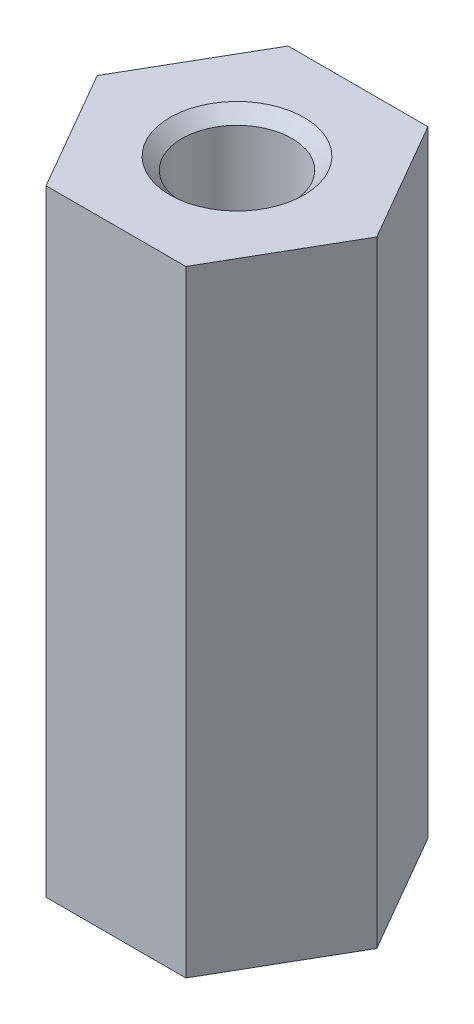
ISO-10303-21;
HEADER;
FILE_DESCRIPTION(('STEP AP214'),'2;1');
FILE_NAME('part.step','',(''),(''),'','','');
FILE_SCHEMA(('AUTOMOTIVE_DESIGN { 1 0 10303 214 1 1 1 1 }'));
ENDSEC;
DATA;
#1=APPLICATION_CONTEXT('core data for automotive mechanical design processes');
#2=APPLICATION_PROTOCOL_DEFINITION('international standard','automotive_design',2000,#1);
#3=PRODUCT_CONTEXT('',#1,'mechanical');
#4=PRODUCT('Part','Part','',(#3));
#5=PRODUCT_RELATED_PRODUCT_CATEGORY('part','',(#4));
#6=PRODUCT_DEFINITION_FORMATION('','',#4);
#7=PRODUCT_DEFINITION_CONTEXT('part definition',#1,'design');
#8=PRODUCT_DEFINITION('design','',#6,#7);
#9=PRODUCT_DEFINITION_SHAPE('','',#8);
#10=(LENGTH_UNIT() NAMED_UNIT(*) SI_UNIT(.MILLI.,.METRE.));
#11=(NAMED_UNIT(*) PLANE_ANGLE_UNIT() SI_UNIT($,.RADIAN.));
#12=(NAMED_UNIT(*) SI_UNIT($,.STERADIAN.) SOLID_ANGLE_UNIT());
#13=UNCERTAINTY_MEASURE_WITH_UNIT(LENGTH_MEASURE(1.E-05),#10,'distance_accuracy_value','');
#14=(GEOMETRIC_REPRESENTATION_CONTEXT(3) GLOBAL_UNCERTAINTY_ASSIGNED_CONTEXT((#13)) GLOBAL_UNIT_ASSIGNED_CONTEXT((#10,
#11,#12)) REPRESENTATION_CONTEXT('',''));
#15=CARTESIAN_POINT('',(0.,0.,0.));
#16=DIRECTION('',(0.,0.,1.));
#17=DIRECTION('',(1.,0.,0.));
#18=AXIS2_PLACEMENT_3D('',#15,#16,#17);
#19=CARTESIAN_POINT('',(1.5877132402715,14.,2.74999999999998));
#20=DIRECTION('',(-0.866025403784441,0.,-0.499999999999995));
#21=DIRECTION('',(-0.499999999999995,0.,0.866025403784442));
#22=AXIS2_PLACEMENT_3D('',#19,#20,#21);
#23=PLANE('',#22);
#24=DIRECTION('',(0.499999999999995,0.,-0.866025403784442));
#25=VECTOR('',#24,1.);
#26=CARTESIAN_POINT('',(1.5877132402715,0.,2.74999999999998));
#27=LINE('',#26,#25);
#28=CARTESIAN_POINT('',(1.5877132402715,0.,2.74999999999998));
#29=VERTEX_POINT('',#28);
#30=CARTESIAN_POINT('',(3.17542648054294,0.,0.));
#31=VERTEX_POINT('',#30);
#32=EDGE_CURVE('E121',#29,#31,#27,.T.);
#33=ORIENTED_EDGE('',*,*,#32,.T.);
#34=DIRECTION('',(0.,-1.,0.));
#35=VECTOR('',#34,1.);
#36=CARTESIAN_POINT('',(3.17542648054294,14.,0.));
#37=LINE('',#36,#35);
#38=CARTESIAN_POINT('',(3.17542648054294,14.,0.));
#39=VERTEX_POINT('',#38);
#40=EDGE_CURVE('E11',#39,#31,#37,.T.);
#41=ORIENTED_EDGE('',*,*,#40,.F.);
#42=DIRECTION('',(0.499999999999995,0.,-0.866025403784442));
#43=VECTOR('',#42,1.);
#44=CARTESIAN_POINT('',(1.5877132402715,14.,2.74999999999998));
#45=LINE('',#44,#43);
#46=CARTESIAN_POINT('',(1.5877132402715,14.,2.74999999999998));
#47=VERTEX_POINT('',#46);
#48=EDGE_CURVE('E132',#47,#39,#45,.T.);
#49=ORIENTED_EDGE('',*,*,#48,.F.);
#50=DIRECTION('',(0.,-1.,0.));
#51=VECTOR('',#50,1.);
#52=CARTESIAN_POINT('',(1.5877132402715,14.,2.74999999999998));
#53=LINE('',#52,#51);
#54=EDGE_CURVE('E117',#47,#29,#53,.T.);
#55=ORIENTED_EDGE('',*,*,#54,.T.);
#56=EDGE_LOOP('',(#33,#41,#49,#55));
#57=FACE_BOUND('',#56,.T.);
#58=ADVANCED_FACE('F37',(#57),#23,.F.);
#59=CARTESIAN_POINT('',(3.17542648054294,14.,0.));
#60=DIRECTION('',(-0.866025403784438,0.,0.500000000000001));
#61=DIRECTION('',(0.500000000000001,0.,0.866025403784438));
#62=AXIS2_PLACEMENT_3D('',#59,#60,#61);
#63=PLANE('',#62);
#64=DIRECTION('',(-0.500000000000001,0.,-0.866025403784438));
#65=VECTOR('',#64,1.);
#66=CARTESIAN_POINT('',(3.17542648054294,0.,0.));
#67=LINE('',#66,#65);
#68=CARTESIAN_POINT('',(1.58771324027146,0.,-2.75));
#69=VERTEX_POINT('',#68);
#70=EDGE_CURVE('E124',#31,#69,#67,.T.);
#71=ORIENTED_EDGE('',*,*,#70,.T.);
#72=DIRECTION('',(0.,-1.,0.));
#73=VECTOR('',#72,1.);
#74=CARTESIAN_POINT('',(1.58771324027146,14.,-2.75));
#75=LINE('',#74,#73);
#76=CARTESIAN_POINT('',(1.58771324027146,14.,-2.75));
#77=VERTEX_POINT('',#76);
#78=EDGE_CURVE('E45',#77,#69,#75,.T.);
#79=ORIENTED_EDGE('',*,*,#78,.F.);
#80=DIRECTION('',(-0.500000000000001,0.,-0.866025403784438));
#81=VECTOR('',#80,1.);
#82=CARTESIAN_POINT('',(3.17542648054294,14.,0.));
#83=LINE('',#82,#81);
#84=EDGE_CURVE('E90',#39,#77,#83,.T.);
#85=ORIENTED_EDGE('',*,*,#84,.F.);
#86=ORIENTED_EDGE('',*,*,#40,.T.);
#87=EDGE_LOOP('',(#71,#79,#85,#86));
#88=FACE_BOUND('',#87,.T.);
#89=ADVANCED_FACE('F157',(#88),#63,.F.);
#90=CARTESIAN_POINT('',(1.58771324027146,14.,-2.75));
#91=DIRECTION('',(0.,0.,1.));
#92=DIRECTION('',(1.,0.,0.));
#93=AXIS2_PLACEMENT_3D('',#90,#91,#92);
#94=PLANE('',#93);
#95=DIRECTION('',(-1.,0.,0.));
#96=VECTOR('',#95,1.);
#97=CARTESIAN_POINT('',(1.58771324027146,0.,-2.75));
#98=LINE('',#97,#96);
#99=CARTESIAN_POINT('',(-1.58771324027148,0.,-2.74999999999999));
#100=VERTEX_POINT('',#99);
#101=EDGE_CURVE('E127',#69,#100,#98,.T.);
#102=ORIENTED_EDGE('',*,*,#101,.T.);
#103=DIRECTION('',(0.,-1.,0.));
#104=VECTOR('',#103,1.);
#105=CARTESIAN_POINT('',(-1.58771324027148,14.,-2.74999999999999));
#106=LINE('',#105,#104);
#107=CARTESIAN_POINT('',(-1.58771324027148,14.,-2.74999999999999));
#108=VERTEX_POINT('',#107);
#109=EDGE_CURVE('E112',#108,#100,#106,.T.);
#110=ORIENTED_EDGE('',*,*,#109,.F.);
#111=DIRECTION('',(-1.,0.,0.));
#112=VECTOR('',#111,1.);
#113=CARTESIAN_POINT('',(1.58771324027146,14.,-2.75));
#114=LINE('',#113,#112);
#115=EDGE_CURVE('E103',#77,#108,#114,.T.);
#116=ORIENTED_EDGE('',*,*,#115,.F.);
#117=ORIENTED_EDGE('',*,*,#78,.T.);
#118=EDGE_LOOP('',(#102,#110,#116,#117));
#119=FACE_BOUND('',#118,.T.);
#120=ADVANCED_FACE('F138',(#119),#94,.F.);
#121=CARTESIAN_POINT('',(-1.58771324027148,14.,-2.74999999999999));
#122=DIRECTION('',(0.866025403784442,0.,0.499999999999995));
#123=DIRECTION('',(0.499999999999995,0.,-0.866025403784442));
#124=AXIS2_PLACEMENT_3D('',#121,#122,#123);
#125=PLANE('',#124);
#126=DIRECTION('',(-0.499999999999995,0.,0.866025403784442));
#127=VECTOR('',#126,1.);
#128=CARTESIAN_POINT('',(-1.58771324027148,0.,-2.74999999999999));
#129=LINE('',#128,#127);
#130=CARTESIAN_POINT('',(-3.17542648054294,0.,0.));
#131=VERTEX_POINT('',#130);
#132=EDGE_CURVE('E111',#100,#131,#129,.T.);
#133=ORIENTED_EDGE('',*,*,#132,.T.);
#134=DIRECTION('',(0.,-1.,0.));
#135=VECTOR('',#134,1.);
#136=CARTESIAN_POINT('',(-3.17542648054294,14.,0.));
#137=LINE('',#136,#135);
#138=CARTESIAN_POINT('',(-3.17542648054294,14.,0.));
#139=VERTEX_POINT('',#138);
#140=EDGE_CURVE('E108',#139,#131,#137,.T.);
#141=ORIENTED_EDGE('',*,*,#140,.F.);
#142=DIRECTION('',(-0.499999999999995,0.,0.866025403784442));
#143=VECTOR('',#142,1.);
#144=CARTESIAN_POINT('',(-1.58771324027148,14.,-2.74999999999999));
#145=LINE('',#144,#143);
#146=EDGE_CURVE('E97',#108,#139,#145,.T.);
#147=ORIENTED_EDGE('',*,*,#146,.F.);
#148=ORIENTED_EDGE('',*,*,#109,.T.);
#149=EDGE_LOOP('',(#133,#141,#147,#148));
#150=FACE_BOUND('',#149,.T.);
#151=ADVANCED_FACE('F109',(#150),#125,.F.);
#152=CARTESIAN_POINT('',(-3.17542648054294,14.,0.));
#153=DIRECTION('',(0.866025403784434,0.,-0.500000000000007));
#154=DIRECTION('',(-0.500000000000007,0.,-0.866025403784435));
#155=AXIS2_PLACEMENT_3D('',#152,#153,#154);
#156=PLANE('',#155);
#157=DIRECTION('',(0.500000000000007,0.,0.866025403784434));
#158=VECTOR('',#157,1.);
#159=CARTESIAN_POINT('',(-3.17542648054294,0.,0.));
#160=LINE('',#159,#158);
#161=CARTESIAN_POINT('',(-1.58771324027144,0.,2.75000000000001));
#162=VERTEX_POINT('',#161);
#163=EDGE_CURVE('E76',#131,#162,#160,.T.);
#164=ORIENTED_EDGE('',*,*,#163,.T.);
#165=DIRECTION('',(0.,-1.,0.));
#166=VECTOR('',#165,1.);
#167=CARTESIAN_POINT('',(-1.58771324027144,14.,2.75000000000001));
#168=LINE('',#167,#166);
#169=CARTESIAN_POINT('',(-1.58771324027144,14.,2.75000000000001));
#170=VERTEX_POINT('',#169);
#171=EDGE_CURVE('E113',#170,#162,#168,.T.);
#172=ORIENTED_EDGE('',*,*,#171,.F.);
#173=DIRECTION('',(0.500000000000007,0.,0.866025403784434));
#174=VECTOR('',#173,1.);
#175=CARTESIAN_POINT('',(-3.17542648054294,14.,0.));
#176=LINE('',#175,#174);
#177=EDGE_CURVE('E101',#139,#170,#176,.T.);
#178=ORIENTED_EDGE('',*,*,#177,.F.);
#179=ORIENTED_EDGE('',*,*,#140,.T.);
#180=EDGE_LOOP('',(#164,#172,#178,#179));
#181=FACE_BOUND('',#180,.T.);
#182=ADVANCED_FACE('F115',(#181),#156,.F.);
#183=CARTESIAN_POINT('',(-1.58771324027144,14.,2.75000000000001));
#184=DIRECTION('',(0.,0.,-1.));
#185=DIRECTION('',(-1.,0.,0.));
#186=AXIS2_PLACEMENT_3D('',#183,#184,#185);
#187=PLANE('',#186);
#188=DIRECTION('',(1.,0.,0.));
#189=VECTOR('',#188,1.);
#190=CARTESIAN_POINT('',(-1.58771324027144,0.,2.75000000000001));
#191=LINE('',#190,#189);
#192=EDGE_CURVE('E82',#162,#29,#191,.T.);
#193=ORIENTED_EDGE('',*,*,#192,.T.);
#194=ORIENTED_EDGE('',*,*,#54,.F.);
#195=DIRECTION('',(1.,0.,0.));
#196=VECTOR('',#195,1.);
#197=CARTESIAN_POINT('',(-1.58771324027144,14.,2.75000000000001));
#198=LINE('',#197,#196);
#199=EDGE_CURVE('E53',#170,#47,#198,.T.);
#200=ORIENTED_EDGE('',*,*,#199,.F.);
#201=ORIENTED_EDGE('',*,*,#171,.T.);
#202=EDGE_LOOP('',(#193,#194,#200,#201));
#203=FACE_BOUND('',#202,.T.);
#204=ADVANCED_FACE('F145',(#203),#187,.F.);
#205=CARTESIAN_POINT('',(0.,14.,0.));
#206=DIRECTION('',(0.,1.,0.));
#207=DIRECTION('',(0.,0.,1.));
#208=AXIS2_PLACEMENT_3D('',#205,#206,#207);
#209=PLANE('',#208);
#210=CARTESIAN_POINT('',(0.,14.,0.));
#211=DIRECTION('',(0.,1.,0.));
#212=DIRECTION('',(0.,0.,1.));
#213=AXIS2_PLACEMENT_3D('',#210,#211,#212);
#214=CIRCLE('',#213,1.525);
#215=CARTESIAN_POINT('',(0.,14.,1.525));
#216=VERTEX_POINT('',#215);
#217=EDGE_CURVE('E229',#216,#216,#214,.T.);
#218=ORIENTED_EDGE('',*,*,#217,.F.);
#219=EDGE_LOOP('',(#218));
#220=FACE_BOUND('',#219,.T.);
#221=ORIENTED_EDGE('',*,*,#48,.T.);
#222=ORIENTED_EDGE('',*,*,#84,.T.);
#223=ORIENTED_EDGE('',*,*,#115,.T.);
#224=ORIENTED_EDGE('',*,*,#146,.T.);
#225=ORIENTED_EDGE('',*,*,#177,.T.);
#226=ORIENTED_EDGE('',*,*,#199,.T.);
#227=EDGE_LOOP('',(#221,#222,#223,#224,#225,#226));
#228=FACE_BOUND('',#227,.T.);
#229=ADVANCED_FACE('F99',(#220,#228),#209,.T.);
#230=CARTESIAN_POINT('',(0.,0.,0.));
#231=DIRECTION('',(0.,1.,0.));
#232=DIRECTION('',(0.,0.,1.));
#233=AXIS2_PLACEMENT_3D('',#230,#231,#232);
#234=PLANE('',#233);
#235=CARTESIAN_POINT('',(0.,0.,0.));
#236=DIRECTION('',(0.,1.,0.));
#237=DIRECTION('',(0.,0.,1.));
#238=AXIS2_PLACEMENT_3D('',#235,#236,#237);
#239=CIRCLE('',#238,1.25);
#240=CARTESIAN_POINT('',(0.,0.,1.25));
#241=VERTEX_POINT('',#240);
#242=EDGE_CURVE('E125',#241,#241,#239,.T.);
#243=ORIENTED_EDGE('',*,*,#242,.T.);
#244=EDGE_LOOP('',(#243));
#245=FACE_BOUND('',#244,.T.);
#246=ORIENTED_EDGE('',*,*,#32,.F.);
#247=ORIENTED_EDGE('',*,*,#192,.F.);
#248=ORIENTED_EDGE('',*,*,#163,.F.);
#249=ORIENTED_EDGE('',*,*,#132,.F.);
#250=ORIENTED_EDGE('',*,*,#101,.F.);
#251=ORIENTED_EDGE('',*,*,#70,.F.);
#252=EDGE_LOOP('',(#246,#247,#248,#249,#250,#251));
#253=FACE_BOUND('',#252,.T.);
#254=ADVANCED_FACE('F141',(#245,#253),#234,.F.);
#255=CARTESIAN_POINT('',(0.,14.,0.));
#256=DIRECTION('',(0.,1.,0.));
#257=DIRECTION('',(0.,0.,1.));
#258=AXIS2_PLACEMENT_3D('',#255,#256,#257);
#259=CYLINDRICAL_SURFACE('',#258,1.25);
#260=ORIENTED_EDGE('',*,*,#242,.F.);
#261=EDGE_LOOP('',(#260));
#262=FACE_BOUND('',#261,.T.);
#263=CARTESIAN_POINT('',(0.,13.725,0.));
#264=DIRECTION('',(0.,1.,0.));
#265=DIRECTION('',(0.,0.,1.));
#266=AXIS2_PLACEMENT_3D('',#263,#264,#265);
#267=CIRCLE('',#266,1.25);
#268=CARTESIAN_POINT('',(0.,13.725,1.25));
#269=VERTEX_POINT('',#268);
#270=EDGE_CURVE('E226',#269,#269,#267,.T.);
#271=ORIENTED_EDGE('',*,*,#270,.T.);
#272=EDGE_LOOP('',(#271));
#273=FACE_BOUND('',#272,.T.);
#274=ADVANCED_FACE('F195',(#262,#273),#259,.F.);
#275=CARTESIAN_POINT('',(0.,14.,0.));
#276=DIRECTION('',(0.,1.,0.));
#277=DIRECTION('',(0.,0.,1.));
#278=AXIS2_PLACEMENT_3D('',#275,#276,#277);
#279=CONICAL_SURFACE('',#278,1.525,0.785398163397449);
#280=ORIENTED_EDGE('',*,*,#270,.F.);
#281=EDGE_LOOP('',(#280));
#282=FACE_BOUND('',#281,.T.);
#283=ORIENTED_EDGE('',*,*,#217,.T.);
#284=EDGE_LOOP('',(#283));
#285=FACE_BOUND('',#284,.T.);
#286=ADVANCED_FACE('F205',(#282,#285),#279,.F.);
#287=CLOSED_SHELL('',(#58,#89,#120,#151,#182,#204,#229,#254,#274,#286));
#288=MANIFOLD_SOLID_BREP('B2',#287);
#289=ADVANCED_BREP_SHAPE_REPRESENTATION('',(#18,#288),#14);
#290=SHAPE_DEFINITION_REPRESENTATION(#9,#289);
ENDSEC;
END-ISO-10303-21;
